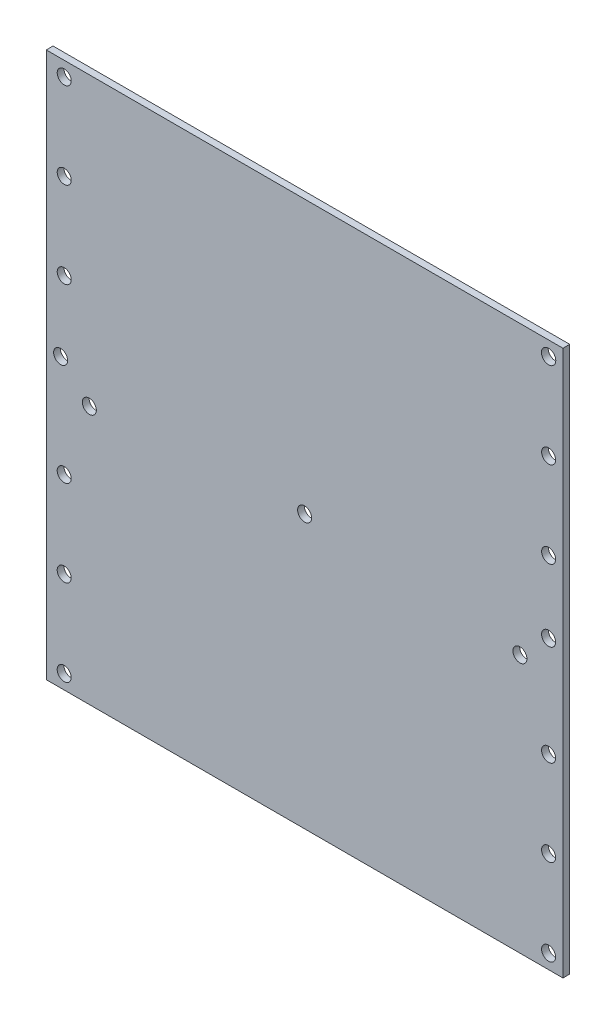
ISO-10303-21;
HEADER;
FILE_DESCRIPTION(('STEP AP214'),'2;1');
FILE_NAME('part.step','',(''),(''),'','','');
FILE_SCHEMA(('AUTOMOTIVE_DESIGN { 1 0 10303 214 1 1 1 1 }'));
ENDSEC;
DATA;
#1=APPLICATION_CONTEXT('core data for automotive mechanical design processes');
#2=APPLICATION_PROTOCOL_DEFINITION('international standard','automotive_design',2000,#1);
#3=PRODUCT_CONTEXT('',#1,'mechanical');
#4=PRODUCT('Part','Part','',(#3));
#5=PRODUCT_RELATED_PRODUCT_CATEGORY('part','',(#4));
#6=PRODUCT_DEFINITION_FORMATION('','',#4);
#7=PRODUCT_DEFINITION_CONTEXT('part definition',#1,'design');
#8=PRODUCT_DEFINITION('design','',#6,#7);
#9=PRODUCT_DEFINITION_SHAPE('','',#8);
#10=(LENGTH_UNIT() NAMED_UNIT(*) SI_UNIT(.MILLI.,.METRE.));
#11=(NAMED_UNIT(*) PLANE_ANGLE_UNIT() SI_UNIT($,.RADIAN.));
#12=(NAMED_UNIT(*) SI_UNIT($,.STERADIAN.) SOLID_ANGLE_UNIT());
#13=UNCERTAINTY_MEASURE_WITH_UNIT(LENGTH_MEASURE(1.E-05),#10,'distance_accuracy_value','');
#14=(GEOMETRIC_REPRESENTATION_CONTEXT(3) GLOBAL_UNCERTAINTY_ASSIGNED_CONTEXT((#13)) GLOBAL_UNIT_ASSIGNED_CONTEXT((#10,
#11,#12)) REPRESENTATION_CONTEXT('',''));
#15=CARTESIAN_POINT('',(0.,0.,0.));
#16=DIRECTION('',(0.,0.,1.));
#17=DIRECTION('',(1.,0.,0.));
#18=AXIS2_PLACEMENT_3D('',#15,#16,#17);
#19=CARTESIAN_POINT('',(-57.15,60.325,1.5));
#20=DIRECTION('',(1.,0.,0.));
#21=DIRECTION('',(0.,0.,-1.));
#22=AXIS2_PLACEMENT_3D('',#19,#20,#21);
#23=PLANE('',#22);
#24=DIRECTION('',(0.,-1.,0.));
#25=VECTOR('',#24,1.);
#26=CARTESIAN_POINT('',(-57.15,60.325,0.));
#27=LINE('',#26,#25);
#28=CARTESIAN_POINT('',(-57.15,60.325,0.));
#29=VERTEX_POINT('',#28);
#30=CARTESIAN_POINT('',(-57.15,-60.325,0.));
#31=VERTEX_POINT('',#30);
#32=EDGE_CURVE('E73',#29,#31,#27,.T.);
#33=ORIENTED_EDGE('',*,*,#32,.T.);
#34=DIRECTION('',(0.,0.,-1.));
#35=VECTOR('',#34,1.);
#36=CARTESIAN_POINT('',(-57.15,-60.325,1.5));
#37=LINE('',#36,#35);
#38=CARTESIAN_POINT('',(-57.15,-60.325,1.5));
#39=VERTEX_POINT('',#38);
#40=EDGE_CURVE('E11',#39,#31,#37,.T.);
#41=ORIENTED_EDGE('',*,*,#40,.F.);
#42=DIRECTION('',(0.,-1.,0.));
#43=VECTOR('',#42,1.);
#44=CARTESIAN_POINT('',(-57.15,60.325,1.5));
#45=LINE('',#44,#43);
#46=CARTESIAN_POINT('',(-57.15,60.325,1.5));
#47=VERTEX_POINT('',#46);
#48=EDGE_CURVE('E96',#47,#39,#45,.T.);
#49=ORIENTED_EDGE('',*,*,#48,.F.);
#50=DIRECTION('',(0.,0.,-1.));
#51=VECTOR('',#50,1.);
#52=CARTESIAN_POINT('',(-57.15,60.325,1.5));
#53=LINE('',#52,#51);
#54=EDGE_CURVE('E85',#47,#29,#53,.T.);
#55=ORIENTED_EDGE('',*,*,#54,.T.);
#56=EDGE_LOOP('',(#33,#41,#49,#55));
#57=FACE_BOUND('',#56,.T.);
#58=ADVANCED_FACE('F29',(#57),#23,.F.);
#59=CARTESIAN_POINT('',(-57.15,-60.325,1.5));
#60=DIRECTION('',(0.,1.,0.));
#61=DIRECTION('',(-1.,0.,0.));
#62=AXIS2_PLACEMENT_3D('',#59,#60,#61);
#63=PLANE('',#62);
#64=DIRECTION('',(1.,0.,0.));
#65=VECTOR('',#64,1.);
#66=CARTESIAN_POINT('',(-57.15,-60.325,0.));
#67=LINE('',#66,#65);
#68=CARTESIAN_POINT('',(57.15,-60.325,0.));
#69=VERTEX_POINT('',#68);
#70=EDGE_CURVE('E69',#31,#69,#67,.T.);
#71=ORIENTED_EDGE('',*,*,#70,.T.);
#72=DIRECTION('',(0.,0.,-1.));
#73=VECTOR('',#72,1.);
#74=CARTESIAN_POINT('',(57.15,-60.325,1.5));
#75=LINE('',#74,#73);
#76=CARTESIAN_POINT('',(57.15,-60.325,1.5));
#77=VERTEX_POINT('',#76);
#78=EDGE_CURVE('E36',#77,#69,#75,.T.);
#79=ORIENTED_EDGE('',*,*,#78,.F.);
#80=DIRECTION('',(1.,0.,0.));
#81=VECTOR('',#80,1.);
#82=CARTESIAN_POINT('',(-57.15,-60.325,1.5));
#83=LINE('',#82,#81);
#84=EDGE_CURVE('E81',#39,#77,#83,.T.);
#85=ORIENTED_EDGE('',*,*,#84,.F.);
#86=ORIENTED_EDGE('',*,*,#40,.T.);
#87=EDGE_LOOP('',(#71,#79,#85,#86));
#88=FACE_BOUND('',#87,.T.);
#89=ADVANCED_FACE('F80',(#88),#63,.F.);
#90=CARTESIAN_POINT('',(57.15,60.325,1.5));
#91=DIRECTION('',(-1.,0.,0.));
#92=DIRECTION('',(0.,-1.,0.));
#93=AXIS2_PLACEMENT_3D('',#90,#91,#92);
#94=PLANE('',#93);
#95=DIRECTION('',(0.,1.,0.));
#96=VECTOR('',#95,1.);
#97=CARTESIAN_POINT('',(57.15,60.325,0.));
#98=LINE('',#97,#96);
#99=CARTESIAN_POINT('',(57.15,60.325,0.));
#100=VERTEX_POINT('',#99);
#101=EDGE_CURVE('E74',#69,#100,#98,.T.);
#102=ORIENTED_EDGE('',*,*,#101,.T.);
#103=DIRECTION('',(0.,0.,-1.));
#104=VECTOR('',#103,1.);
#105=CARTESIAN_POINT('',(57.15,60.325,1.5));
#106=LINE('',#105,#104);
#107=CARTESIAN_POINT('',(57.15,60.325,1.5));
#108=VERTEX_POINT('',#107);
#109=EDGE_CURVE('E102',#108,#100,#106,.T.);
#110=ORIENTED_EDGE('',*,*,#109,.F.);
#111=DIRECTION('',(0.,1.,0.));
#112=VECTOR('',#111,1.);
#113=CARTESIAN_POINT('',(57.15,60.325,1.5));
#114=LINE('',#113,#112);
#115=EDGE_CURVE('E48',#77,#108,#114,.T.);
#116=ORIENTED_EDGE('',*,*,#115,.F.);
#117=ORIENTED_EDGE('',*,*,#78,.T.);
#118=EDGE_LOOP('',(#102,#110,#116,#117));
#119=FACE_BOUND('',#118,.T.);
#120=ADVANCED_FACE('F105',(#119),#94,.F.);
#121=CARTESIAN_POINT('',(-57.15,60.325,1.5));
#122=DIRECTION('',(0.,-1.,0.));
#123=DIRECTION('',(1.,0.,0.));
#124=AXIS2_PLACEMENT_3D('',#121,#122,#123);
#125=PLANE('',#124);
#126=DIRECTION('',(-1.,0.,0.));
#127=VECTOR('',#126,1.);
#128=CARTESIAN_POINT('',(-57.15,60.325,0.));
#129=LINE('',#128,#127);
#130=EDGE_CURVE('E94',#100,#29,#129,.T.);
#131=ORIENTED_EDGE('',*,*,#130,.T.);
#132=ORIENTED_EDGE('',*,*,#54,.F.);
#133=DIRECTION('',(-1.,0.,0.));
#134=VECTOR('',#133,1.);
#135=CARTESIAN_POINT('',(-57.15,60.325,1.5));
#136=LINE('',#135,#134);
#137=EDGE_CURVE('E43',#108,#47,#136,.T.);
#138=ORIENTED_EDGE('',*,*,#137,.F.);
#139=ORIENTED_EDGE('',*,*,#109,.T.);
#140=EDGE_LOOP('',(#131,#132,#138,#139));
#141=FACE_BOUND('',#140,.T.);
#142=ADVANCED_FACE('F107',(#141),#125,.F.);
#143=CARTESIAN_POINT('',(-57.15,60.325,1.5));
#144=DIRECTION('',(0.,0.,1.));
#145=DIRECTION('',(1.,0.,0.));
#146=AXIS2_PLACEMENT_3D('',#143,#144,#145);
#147=PLANE('',#146);
#148=CARTESIAN_POINT('',(53.975,-57.15,1.5));
#149=DIRECTION('',(0.,0.,1.));
#150=DIRECTION('',(1.,0.,0.));
#151=AXIS2_PLACEMENT_3D('',#148,#149,#150);
#152=CIRCLE('',#151,1.55);
#153=CARTESIAN_POINT('',(55.525,-57.15,1.5));
#154=VERTEX_POINT('',#153);
#155=EDGE_CURVE('E324',#154,#154,#152,.T.);
#156=ORIENTED_EDGE('',*,*,#155,.F.);
#157=EDGE_LOOP('',(#156));
#158=FACE_BOUND('',#157,.T.);
#159=CARTESIAN_POINT('',(53.975,-38.1,1.5));
#160=DIRECTION('',(0.,0.,1.));
#161=DIRECTION('',(1.,0.,0.));
#162=AXIS2_PLACEMENT_3D('',#159,#160,#161);
#163=CIRCLE('',#162,1.55);
#164=CARTESIAN_POINT('',(55.525,-38.1,1.5));
#165=VERTEX_POINT('',#164);
#166=EDGE_CURVE('E326',#165,#165,#163,.T.);
#167=ORIENTED_EDGE('',*,*,#166,.F.);
#168=EDGE_LOOP('',(#167));
#169=FACE_BOUND('',#168,.T.);
#170=CARTESIAN_POINT('',(53.975,-19.05,1.5));
#171=DIRECTION('',(0.,0.,1.));
#172=DIRECTION('',(1.,0.,0.));
#173=AXIS2_PLACEMENT_3D('',#170,#171,#172);
#174=CIRCLE('',#173,1.55);
#175=CARTESIAN_POINT('',(55.525,-19.05,1.5));
#176=VERTEX_POINT('',#175);
#177=EDGE_CURVE('E334',#176,#176,#174,.T.);
#178=ORIENTED_EDGE('',*,*,#177,.F.);
#179=EDGE_LOOP('',(#178));
#180=FACE_BOUND('',#179,.T.);
#181=CARTESIAN_POINT('',(53.975,19.05,1.5));
#182=DIRECTION('',(0.,0.,1.));
#183=DIRECTION('',(1.,0.,0.));
#184=AXIS2_PLACEMENT_3D('',#181,#182,#183);
#185=CIRCLE('',#184,1.55);
#186=CARTESIAN_POINT('',(55.525,19.05,1.5));
#187=VERTEX_POINT('',#186);
#188=EDGE_CURVE('E340',#187,#187,#185,.T.);
#189=ORIENTED_EDGE('',*,*,#188,.F.);
#190=EDGE_LOOP('',(#189));
#191=FACE_BOUND('',#190,.T.);
#192=CARTESIAN_POINT('',(53.975,38.1,1.5));
#193=DIRECTION('',(0.,0.,1.));
#194=DIRECTION('',(1.,0.,0.));
#195=AXIS2_PLACEMENT_3D('',#192,#193,#194);
#196=CIRCLE('',#195,1.55);
#197=CARTESIAN_POINT('',(55.525,38.1,1.5));
#198=VERTEX_POINT('',#197);
#199=EDGE_CURVE('E346',#198,#198,#196,.T.);
#200=ORIENTED_EDGE('',*,*,#199,.F.);
#201=EDGE_LOOP('',(#200));
#202=FACE_BOUND('',#201,.T.);
#203=CARTESIAN_POINT('',(53.975,57.15,1.5));
#204=DIRECTION('',(0.,0.,1.));
#205=DIRECTION('',(1.,0.,0.));
#206=AXIS2_PLACEMENT_3D('',#203,#204,#205);
#207=CIRCLE('',#206,1.58750000000001);
#208=CARTESIAN_POINT('',(55.5625,57.15,1.5));
#209=VERTEX_POINT('',#208);
#210=EDGE_CURVE('E352',#209,#209,#207,.T.);
#211=ORIENTED_EDGE('',*,*,#210,.F.);
#212=EDGE_LOOP('',(#211));
#213=FACE_BOUND('',#212,.T.);
#214=CARTESIAN_POINT('',(-53.18125,-57.15,1.5));
#215=DIRECTION('',(0.,0.,1.));
#216=DIRECTION('',(1.,0.,0.));
#217=AXIS2_PLACEMENT_3D('',#214,#215,#216);
#218=CIRCLE('',#217,1.55);
#219=CARTESIAN_POINT('',(-51.63125,-57.15,1.5));
#220=VERTEX_POINT('',#219);
#221=EDGE_CURVE('E358',#220,#220,#218,.T.);
#222=ORIENTED_EDGE('',*,*,#221,.F.);
#223=EDGE_LOOP('',(#222));
#224=FACE_BOUND('',#223,.T.);
#225=CARTESIAN_POINT('',(-53.18125,-38.1,1.5));
#226=DIRECTION('',(0.,0.,1.));
#227=DIRECTION('',(1.,0.,0.));
#228=AXIS2_PLACEMENT_3D('',#225,#226,#227);
#229=CIRCLE('',#228,1.55);
#230=CARTESIAN_POINT('',(-51.63125,-38.1,1.5));
#231=VERTEX_POINT('',#230);
#232=EDGE_CURVE('E364',#231,#231,#229,.T.);
#233=ORIENTED_EDGE('',*,*,#232,.F.);
#234=EDGE_LOOP('',(#233));
#235=FACE_BOUND('',#234,.T.);
#236=CARTESIAN_POINT('',(-53.18125,19.05,1.5));
#237=DIRECTION('',(0.,0.,1.));
#238=DIRECTION('',(1.,0.,0.));
#239=AXIS2_PLACEMENT_3D('',#236,#237,#238);
#240=CIRCLE('',#239,1.55);
#241=CARTESIAN_POINT('',(-51.63125,19.05,1.5));
#242=VERTEX_POINT('',#241);
#243=EDGE_CURVE('E370',#242,#242,#240,.T.);
#244=ORIENTED_EDGE('',*,*,#243,.F.);
#245=EDGE_LOOP('',(#244));
#246=FACE_BOUND('',#245,.T.);
#247=CARTESIAN_POINT('',(-53.18125,38.1,1.5));
#248=DIRECTION('',(0.,0.,1.));
#249=DIRECTION('',(1.,0.,0.));
#250=AXIS2_PLACEMENT_3D('',#247,#248,#249);
#251=CIRCLE('',#250,1.55);
#252=CARTESIAN_POINT('',(-51.63125,38.1,1.5));
#253=VERTEX_POINT('',#252);
#254=EDGE_CURVE('E376',#253,#253,#251,.T.);
#255=ORIENTED_EDGE('',*,*,#254,.F.);
#256=EDGE_LOOP('',(#255));
#257=FACE_BOUND('',#256,.T.);
#258=CARTESIAN_POINT('',(-53.18125,-19.05,1.5));
#259=DIRECTION('',(0.,0.,1.));
#260=DIRECTION('',(1.,0.,0.));
#261=AXIS2_PLACEMENT_3D('',#258,#259,#260);
#262=CIRCLE('',#261,1.55);
#263=CARTESIAN_POINT('',(-51.63125,-19.05,1.5));
#264=VERTEX_POINT('',#263);
#265=EDGE_CURVE('E382',#264,#264,#262,.T.);
#266=ORIENTED_EDGE('',*,*,#265,.F.);
#267=EDGE_LOOP('',(#266));
#268=FACE_BOUND('',#267,.T.);
#269=CARTESIAN_POINT('',(-53.18125,57.15,1.5));
#270=DIRECTION('',(0.,0.,1.));
#271=DIRECTION('',(1.,0.,0.));
#272=AXIS2_PLACEMENT_3D('',#269,#270,#271);
#273=CIRCLE('',#272,1.55);
#274=CARTESIAN_POINT('',(-51.63125,57.15,1.5));
#275=VERTEX_POINT('',#274);
#276=EDGE_CURVE('E388',#275,#275,#273,.T.);
#277=ORIENTED_EDGE('',*,*,#276,.F.);
#278=EDGE_LOOP('',(#277));
#279=FACE_BOUND('',#278,.T.);
#280=CARTESIAN_POINT('',(0.,0.,1.5));
#281=DIRECTION('',(0.,0.,1.));
#282=DIRECTION('',(1.,0.,0.));
#283=AXIS2_PLACEMENT_3D('',#280,#281,#282);
#284=CIRCLE('',#283,1.55);
#285=CARTESIAN_POINT('',(1.55,0.,1.5));
#286=VERTEX_POINT('',#285);
#287=EDGE_CURVE('E394',#286,#286,#284,.T.);
#288=ORIENTED_EDGE('',*,*,#287,.F.);
#289=EDGE_LOOP('',(#288));
#290=FACE_BOUND('',#289,.T.);
#291=CARTESIAN_POINT('',(47.625,-3.175,1.5));
#292=DIRECTION('',(0.,0.,1.));
#293=DIRECTION('',(1.,0.,0.));
#294=AXIS2_PLACEMENT_3D('',#291,#292,#293);
#295=CIRCLE('',#294,1.55);
#296=CARTESIAN_POINT('',(49.175,-3.175,1.5));
#297=VERTEX_POINT('',#296);
#298=EDGE_CURVE('E400',#297,#297,#295,.T.);
#299=ORIENTED_EDGE('',*,*,#298,.F.);
#300=EDGE_LOOP('',(#299));
#301=FACE_BOUND('',#300,.T.);
#302=CARTESIAN_POINT('',(53.975,3.175,1.5));
#303=DIRECTION('',(0.,0.,1.));
#304=DIRECTION('',(1.,0.,0.));
#305=AXIS2_PLACEMENT_3D('',#302,#303,#304);
#306=CIRCLE('',#305,1.55);
#307=CARTESIAN_POINT('',(55.525,3.175,1.5));
#308=VERTEX_POINT('',#307);
#309=EDGE_CURVE('E406',#308,#308,#306,.T.);
#310=ORIENTED_EDGE('',*,*,#309,.F.);
#311=EDGE_LOOP('',(#310));
#312=FACE_BOUND('',#311,.T.);
#313=CARTESIAN_POINT('',(-47.625,-3.175,1.5));
#314=DIRECTION('',(0.,0.,1.));
#315=DIRECTION('',(1.,0.,0.));
#316=AXIS2_PLACEMENT_3D('',#313,#314,#315);
#317=CIRCLE('',#316,1.55);
#318=CARTESIAN_POINT('',(-46.075,-3.175,1.5));
#319=VERTEX_POINT('',#318);
#320=EDGE_CURVE('E412',#319,#319,#317,.T.);
#321=ORIENTED_EDGE('',*,*,#320,.F.);
#322=EDGE_LOOP('',(#321));
#323=FACE_BOUND('',#322,.T.);
#324=CARTESIAN_POINT('',(-53.975,3.175,1.5));
#325=DIRECTION('',(0.,0.,1.));
#326=DIRECTION('',(1.,0.,0.));
#327=AXIS2_PLACEMENT_3D('',#324,#325,#326);
#328=CIRCLE('',#327,1.55);
#329=CARTESIAN_POINT('',(-52.425,3.175,1.5));
#330=VERTEX_POINT('',#329);
#331=EDGE_CURVE('E89',#330,#330,#328,.T.);
#332=ORIENTED_EDGE('',*,*,#331,.F.);
#333=EDGE_LOOP('',(#332));
#334=FACE_BOUND('',#333,.T.);
#335=ORIENTED_EDGE('',*,*,#48,.T.);
#336=ORIENTED_EDGE('',*,*,#84,.T.);
#337=ORIENTED_EDGE('',*,*,#115,.T.);
#338=ORIENTED_EDGE('',*,*,#137,.T.);
#339=EDGE_LOOP('',(#335,#336,#337,#338));
#340=FACE_BOUND('',#339,.T.);
#341=ADVANCED_FACE('F108',(#158,#169,#180,#191,#202,#213,#224,#235,#246,#257,#268,#279,#290,
#301,#312,#323,#334,#340),#147,.T.);
#342=CARTESIAN_POINT('',(-57.15,60.325,0.));
#343=DIRECTION('',(0.,0.,1.));
#344=DIRECTION('',(1.,0.,0.));
#345=AXIS2_PLACEMENT_3D('',#342,#343,#344);
#346=PLANE('',#345);
#347=CARTESIAN_POINT('',(53.975,-57.15,0.));
#348=DIRECTION('',(0.,0.,1.));
#349=DIRECTION('',(1.,0.,0.));
#350=AXIS2_PLACEMENT_3D('',#347,#348,#349);
#351=CIRCLE('',#350,1.55);
#352=CARTESIAN_POINT('',(55.525,-57.15,0.));
#353=VERTEX_POINT('',#352);
#354=EDGE_CURVE('E322',#353,#353,#351,.T.);
#355=ORIENTED_EDGE('',*,*,#354,.T.);
#356=EDGE_LOOP('',(#355));
#357=FACE_BOUND('',#356,.T.);
#358=CARTESIAN_POINT('',(53.975,-38.1,0.));
#359=DIRECTION('',(0.,0.,1.));
#360=DIRECTION('',(1.,0.,0.));
#361=AXIS2_PLACEMENT_3D('',#358,#359,#360);
#362=CIRCLE('',#361,1.55);
#363=CARTESIAN_POINT('',(55.525,-38.1,0.));
#364=VERTEX_POINT('',#363);
#365=EDGE_CURVE('E331',#364,#364,#362,.T.);
#366=ORIENTED_EDGE('',*,*,#365,.T.);
#367=EDGE_LOOP('',(#366));
#368=FACE_BOUND('',#367,.T.);
#369=CARTESIAN_POINT('',(53.975,-19.05,0.));
#370=DIRECTION('',(0.,0.,1.));
#371=DIRECTION('',(1.,0.,0.));
#372=AXIS2_PLACEMENT_3D('',#369,#370,#371);
#373=CIRCLE('',#372,1.55);
#374=CARTESIAN_POINT('',(55.525,-19.05,0.));
#375=VERTEX_POINT('',#374);
#376=EDGE_CURVE('E337',#375,#375,#373,.T.);
#377=ORIENTED_EDGE('',*,*,#376,.T.);
#378=EDGE_LOOP('',(#377));
#379=FACE_BOUND('',#378,.T.);
#380=CARTESIAN_POINT('',(53.975,19.05,0.));
#381=DIRECTION('',(0.,0.,1.));
#382=DIRECTION('',(1.,0.,0.));
#383=AXIS2_PLACEMENT_3D('',#380,#381,#382);
#384=CIRCLE('',#383,1.55);
#385=CARTESIAN_POINT('',(55.525,19.05,0.));
#386=VERTEX_POINT('',#385);
#387=EDGE_CURVE('E343',#386,#386,#384,.T.);
#388=ORIENTED_EDGE('',*,*,#387,.T.);
#389=EDGE_LOOP('',(#388));
#390=FACE_BOUND('',#389,.T.);
#391=CARTESIAN_POINT('',(53.975,38.1,0.));
#392=DIRECTION('',(0.,0.,1.));
#393=DIRECTION('',(1.,0.,0.));
#394=AXIS2_PLACEMENT_3D('',#391,#392,#393);
#395=CIRCLE('',#394,1.55);
#396=CARTESIAN_POINT('',(55.525,38.1,0.));
#397=VERTEX_POINT('',#396);
#398=EDGE_CURVE('E349',#397,#397,#395,.T.);
#399=ORIENTED_EDGE('',*,*,#398,.T.);
#400=EDGE_LOOP('',(#399));
#401=FACE_BOUND('',#400,.T.);
#402=CARTESIAN_POINT('',(53.975,57.15,0.));
#403=DIRECTION('',(0.,0.,1.));
#404=DIRECTION('',(1.,0.,0.));
#405=AXIS2_PLACEMENT_3D('',#402,#403,#404);
#406=CIRCLE('',#405,1.58750000000001);
#407=CARTESIAN_POINT('',(55.5625,57.15,0.));
#408=VERTEX_POINT('',#407);
#409=EDGE_CURVE('E355',#408,#408,#406,.T.);
#410=ORIENTED_EDGE('',*,*,#409,.T.);
#411=EDGE_LOOP('',(#410));
#412=FACE_BOUND('',#411,.T.);
#413=CARTESIAN_POINT('',(-53.18125,-57.15,0.));
#414=DIRECTION('',(0.,0.,1.));
#415=DIRECTION('',(1.,0.,0.));
#416=AXIS2_PLACEMENT_3D('',#413,#414,#415);
#417=CIRCLE('',#416,1.55);
#418=CARTESIAN_POINT('',(-51.63125,-57.15,0.));
#419=VERTEX_POINT('',#418);
#420=EDGE_CURVE('E361',#419,#419,#417,.T.);
#421=ORIENTED_EDGE('',*,*,#420,.T.);
#422=EDGE_LOOP('',(#421));
#423=FACE_BOUND('',#422,.T.);
#424=CARTESIAN_POINT('',(-53.18125,-38.1,0.));
#425=DIRECTION('',(0.,0.,1.));
#426=DIRECTION('',(1.,0.,0.));
#427=AXIS2_PLACEMENT_3D('',#424,#425,#426);
#428=CIRCLE('',#427,1.55);
#429=CARTESIAN_POINT('',(-51.63125,-38.1,0.));
#430=VERTEX_POINT('',#429);
#431=EDGE_CURVE('E367',#430,#430,#428,.T.);
#432=ORIENTED_EDGE('',*,*,#431,.T.);
#433=EDGE_LOOP('',(#432));
#434=FACE_BOUND('',#433,.T.);
#435=CARTESIAN_POINT('',(-53.18125,19.05,0.));
#436=DIRECTION('',(0.,0.,1.));
#437=DIRECTION('',(1.,0.,0.));
#438=AXIS2_PLACEMENT_3D('',#435,#436,#437);
#439=CIRCLE('',#438,1.55);
#440=CARTESIAN_POINT('',(-51.63125,19.05,0.));
#441=VERTEX_POINT('',#440);
#442=EDGE_CURVE('E373',#441,#441,#439,.T.);
#443=ORIENTED_EDGE('',*,*,#442,.T.);
#444=EDGE_LOOP('',(#443));
#445=FACE_BOUND('',#444,.T.);
#446=CARTESIAN_POINT('',(-53.18125,38.1,0.));
#447=DIRECTION('',(0.,0.,1.));
#448=DIRECTION('',(1.,0.,0.));
#449=AXIS2_PLACEMENT_3D('',#446,#447,#448);
#450=CIRCLE('',#449,1.55);
#451=CARTESIAN_POINT('',(-51.63125,38.1,0.));
#452=VERTEX_POINT('',#451);
#453=EDGE_CURVE('E379',#452,#452,#450,.T.);
#454=ORIENTED_EDGE('',*,*,#453,.T.);
#455=EDGE_LOOP('',(#454));
#456=FACE_BOUND('',#455,.T.);
#457=CARTESIAN_POINT('',(-53.18125,-19.05,0.));
#458=DIRECTION('',(0.,0.,1.));
#459=DIRECTION('',(1.,0.,0.));
#460=AXIS2_PLACEMENT_3D('',#457,#458,#459);
#461=CIRCLE('',#460,1.55);
#462=CARTESIAN_POINT('',(-51.63125,-19.05,0.));
#463=VERTEX_POINT('',#462);
#464=EDGE_CURVE('E385',#463,#463,#461,.T.);
#465=ORIENTED_EDGE('',*,*,#464,.T.);
#466=EDGE_LOOP('',(#465));
#467=FACE_BOUND('',#466,.T.);
#468=CARTESIAN_POINT('',(-53.18125,57.15,0.));
#469=DIRECTION('',(0.,0.,1.));
#470=DIRECTION('',(1.,0.,0.));
#471=AXIS2_PLACEMENT_3D('',#468,#469,#470);
#472=CIRCLE('',#471,1.55);
#473=CARTESIAN_POINT('',(-51.63125,57.15,0.));
#474=VERTEX_POINT('',#473);
#475=EDGE_CURVE('E391',#474,#474,#472,.T.);
#476=ORIENTED_EDGE('',*,*,#475,.T.);
#477=EDGE_LOOP('',(#476));
#478=FACE_BOUND('',#477,.T.);
#479=CARTESIAN_POINT('',(0.,0.,0.));
#480=DIRECTION('',(0.,0.,1.));
#481=DIRECTION('',(1.,0.,0.));
#482=AXIS2_PLACEMENT_3D('',#479,#480,#481);
#483=CIRCLE('',#482,1.55);
#484=CARTESIAN_POINT('',(1.55,0.,0.));
#485=VERTEX_POINT('',#484);
#486=EDGE_CURVE('E397',#485,#485,#483,.T.);
#487=ORIENTED_EDGE('',*,*,#486,.T.);
#488=EDGE_LOOP('',(#487));
#489=FACE_BOUND('',#488,.T.);
#490=CARTESIAN_POINT('',(47.625,-3.175,0.));
#491=DIRECTION('',(0.,0.,1.));
#492=DIRECTION('',(1.,0.,0.));
#493=AXIS2_PLACEMENT_3D('',#490,#491,#492);
#494=CIRCLE('',#493,1.55);
#495=CARTESIAN_POINT('',(49.175,-3.175,0.));
#496=VERTEX_POINT('',#495);
#497=EDGE_CURVE('E403',#496,#496,#494,.T.);
#498=ORIENTED_EDGE('',*,*,#497,.T.);
#499=EDGE_LOOP('',(#498));
#500=FACE_BOUND('',#499,.T.);
#501=CARTESIAN_POINT('',(53.975,3.175,0.));
#502=DIRECTION('',(0.,0.,1.));
#503=DIRECTION('',(1.,0.,0.));
#504=AXIS2_PLACEMENT_3D('',#501,#502,#503);
#505=CIRCLE('',#504,1.55);
#506=CARTESIAN_POINT('',(55.525,3.175,0.));
#507=VERTEX_POINT('',#506);
#508=EDGE_CURVE('E409',#507,#507,#505,.T.);
#509=ORIENTED_EDGE('',*,*,#508,.T.);
#510=EDGE_LOOP('',(#509));
#511=FACE_BOUND('',#510,.T.);
#512=CARTESIAN_POINT('',(-47.625,-3.175,0.));
#513=DIRECTION('',(0.,0.,1.));
#514=DIRECTION('',(1.,0.,0.));
#515=AXIS2_PLACEMENT_3D('',#512,#513,#514);
#516=CIRCLE('',#515,1.55);
#517=CARTESIAN_POINT('',(-46.075,-3.175,0.));
#518=VERTEX_POINT('',#517);
#519=EDGE_CURVE('E415',#518,#518,#516,.T.);
#520=ORIENTED_EDGE('',*,*,#519,.T.);
#521=EDGE_LOOP('',(#520));
#522=FACE_BOUND('',#521,.T.);
#523=CARTESIAN_POINT('',(-53.975,3.175,0.));
#524=DIRECTION('',(0.,0.,1.));
#525=DIRECTION('',(1.,0.,0.));
#526=AXIS2_PLACEMENT_3D('',#523,#524,#525);
#527=CIRCLE('',#526,1.55);
#528=CARTESIAN_POINT('',(-52.425,3.175,0.));
#529=VERTEX_POINT('',#528);
#530=EDGE_CURVE('E86',#529,#529,#527,.T.);
#531=ORIENTED_EDGE('',*,*,#530,.T.);
#532=EDGE_LOOP('',(#531));
#533=FACE_BOUND('',#532,.T.);
#534=ORIENTED_EDGE('',*,*,#32,.F.);
#535=ORIENTED_EDGE('',*,*,#130,.F.);
#536=ORIENTED_EDGE('',*,*,#101,.F.);
#537=ORIENTED_EDGE('',*,*,#70,.F.);
#538=EDGE_LOOP('',(#534,#535,#536,#537));
#539=FACE_BOUND('',#538,.T.);
#540=ADVANCED_FACE('F70',(#357,#368,#379,#390,#401,#412,#423,#434,#445,#456,#467,#478,#489,#500,
#511,#522,#533,#539),#346,.F.);
#541=CARTESIAN_POINT('',(-53.975,3.175,0.));
#542=DIRECTION('',(0.,0.,1.));
#543=DIRECTION('',(1.,0.,0.));
#544=AXIS2_PLACEMENT_3D('',#541,#542,#543);
#545=CYLINDRICAL_SURFACE('',#544,1.55);
#546=ORIENTED_EDGE('',*,*,#530,.F.);
#547=EDGE_LOOP('',(#546));
#548=FACE_BOUND('',#547,.T.);
#549=ORIENTED_EDGE('',*,*,#331,.T.);
#550=EDGE_LOOP('',(#549));
#551=FACE_BOUND('',#550,.T.);
#552=ADVANCED_FACE('F116',(#548,#551),#545,.F.);
#553=CARTESIAN_POINT('',(-47.625,-3.175,0.));
#554=DIRECTION('',(0.,0.,1.));
#555=DIRECTION('',(1.,0.,0.));
#556=AXIS2_PLACEMENT_3D('',#553,#554,#555);
#557=CYLINDRICAL_SURFACE('',#556,1.55);
#558=ORIENTED_EDGE('',*,*,#519,.F.);
#559=EDGE_LOOP('',(#558));
#560=FACE_BOUND('',#559,.T.);
#561=ORIENTED_EDGE('',*,*,#320,.T.);
#562=EDGE_LOOP('',(#561));
#563=FACE_BOUND('',#562,.T.);
#564=ADVANCED_FACE('F155',(#560,#563),#557,.F.);
#565=CARTESIAN_POINT('',(53.975,3.175,0.));
#566=DIRECTION('',(0.,0.,1.));
#567=DIRECTION('',(1.,0.,0.));
#568=AXIS2_PLACEMENT_3D('',#565,#566,#567);
#569=CYLINDRICAL_SURFACE('',#568,1.55);
#570=ORIENTED_EDGE('',*,*,#508,.F.);
#571=EDGE_LOOP('',(#570));
#572=FACE_BOUND('',#571,.T.);
#573=ORIENTED_EDGE('',*,*,#309,.T.);
#574=EDGE_LOOP('',(#573));
#575=FACE_BOUND('',#574,.T.);
#576=ADVANCED_FACE('F165',(#572,#575),#569,.F.);
#577=CARTESIAN_POINT('',(47.625,-3.175,0.));
#578=DIRECTION('',(0.,0.,1.));
#579=DIRECTION('',(1.,0.,0.));
#580=AXIS2_PLACEMENT_3D('',#577,#578,#579);
#581=CYLINDRICAL_SURFACE('',#580,1.55);
#582=ORIENTED_EDGE('',*,*,#497,.F.);
#583=EDGE_LOOP('',(#582));
#584=FACE_BOUND('',#583,.T.);
#585=ORIENTED_EDGE('',*,*,#298,.T.);
#586=EDGE_LOOP('',(#585));
#587=FACE_BOUND('',#586,.T.);
#588=ADVANCED_FACE('F175',(#584,#587),#581,.F.);
#589=CARTESIAN_POINT('',(0.,0.,0.));
#590=DIRECTION('',(0.,0.,1.));
#591=DIRECTION('',(1.,0.,0.));
#592=AXIS2_PLACEMENT_3D('',#589,#590,#591);
#593=CYLINDRICAL_SURFACE('',#592,1.55);
#594=ORIENTED_EDGE('',*,*,#486,.F.);
#595=EDGE_LOOP('',(#594));
#596=FACE_BOUND('',#595,.T.);
#597=ORIENTED_EDGE('',*,*,#287,.T.);
#598=EDGE_LOOP('',(#597));
#599=FACE_BOUND('',#598,.T.);
#600=ADVANCED_FACE('F185',(#596,#599),#593,.F.);
#601=CARTESIAN_POINT('',(-53.18125,57.15,0.));
#602=DIRECTION('',(0.,0.,1.));
#603=DIRECTION('',(1.,0.,0.));
#604=AXIS2_PLACEMENT_3D('',#601,#602,#603);
#605=CYLINDRICAL_SURFACE('',#604,1.55);
#606=ORIENTED_EDGE('',*,*,#475,.F.);
#607=EDGE_LOOP('',(#606));
#608=FACE_BOUND('',#607,.T.);
#609=ORIENTED_EDGE('',*,*,#276,.T.);
#610=EDGE_LOOP('',(#609));
#611=FACE_BOUND('',#610,.T.);
#612=ADVANCED_FACE('F195',(#608,#611),#605,.F.);
#613=CARTESIAN_POINT('',(-53.18125,-19.05,0.));
#614=DIRECTION('',(0.,0.,1.));
#615=DIRECTION('',(1.,0.,0.));
#616=AXIS2_PLACEMENT_3D('',#613,#614,#615);
#617=CYLINDRICAL_SURFACE('',#616,1.55);
#618=ORIENTED_EDGE('',*,*,#464,.F.);
#619=EDGE_LOOP('',(#618));
#620=FACE_BOUND('',#619,.T.);
#621=ORIENTED_EDGE('',*,*,#265,.T.);
#622=EDGE_LOOP('',(#621));
#623=FACE_BOUND('',#622,.T.);
#624=ADVANCED_FACE('F205',(#620,#623),#617,.F.);
#625=CARTESIAN_POINT('',(-53.18125,38.1,0.));
#626=DIRECTION('',(0.,0.,1.));
#627=DIRECTION('',(1.,0.,0.));
#628=AXIS2_PLACEMENT_3D('',#625,#626,#627);
#629=CYLINDRICAL_SURFACE('',#628,1.55);
#630=ORIENTED_EDGE('',*,*,#453,.F.);
#631=EDGE_LOOP('',(#630));
#632=FACE_BOUND('',#631,.T.);
#633=ORIENTED_EDGE('',*,*,#254,.T.);
#634=EDGE_LOOP('',(#633));
#635=FACE_BOUND('',#634,.T.);
#636=ADVANCED_FACE('F215',(#632,#635),#629,.F.);
#637=CARTESIAN_POINT('',(-53.18125,19.05,0.));
#638=DIRECTION('',(0.,0.,1.));
#639=DIRECTION('',(1.,0.,0.));
#640=AXIS2_PLACEMENT_3D('',#637,#638,#639);
#641=CYLINDRICAL_SURFACE('',#640,1.55);
#642=ORIENTED_EDGE('',*,*,#442,.F.);
#643=EDGE_LOOP('',(#642));
#644=FACE_BOUND('',#643,.T.);
#645=ORIENTED_EDGE('',*,*,#243,.T.);
#646=EDGE_LOOP('',(#645));
#647=FACE_BOUND('',#646,.T.);
#648=ADVANCED_FACE('F225',(#644,#647),#641,.F.);
#649=CARTESIAN_POINT('',(-53.18125,-38.1,0.));
#650=DIRECTION('',(0.,0.,1.));
#651=DIRECTION('',(1.,0.,0.));
#652=AXIS2_PLACEMENT_3D('',#649,#650,#651);
#653=CYLINDRICAL_SURFACE('',#652,1.55);
#654=ORIENTED_EDGE('',*,*,#431,.F.);
#655=EDGE_LOOP('',(#654));
#656=FACE_BOUND('',#655,.T.);
#657=ORIENTED_EDGE('',*,*,#232,.T.);
#658=EDGE_LOOP('',(#657));
#659=FACE_BOUND('',#658,.T.);
#660=ADVANCED_FACE('F235',(#656,#659),#653,.F.);
#661=CARTESIAN_POINT('',(-53.18125,-57.15,0.));
#662=DIRECTION('',(0.,0.,1.));
#663=DIRECTION('',(1.,0.,0.));
#664=AXIS2_PLACEMENT_3D('',#661,#662,#663);
#665=CYLINDRICAL_SURFACE('',#664,1.55);
#666=ORIENTED_EDGE('',*,*,#420,.F.);
#667=EDGE_LOOP('',(#666));
#668=FACE_BOUND('',#667,.T.);
#669=ORIENTED_EDGE('',*,*,#221,.T.);
#670=EDGE_LOOP('',(#669));
#671=FACE_BOUND('',#670,.T.);
#672=ADVANCED_FACE('F245',(#668,#671),#665,.F.);
#673=CARTESIAN_POINT('',(53.975,57.15,0.));
#674=DIRECTION('',(0.,0.,1.));
#675=DIRECTION('',(1.,0.,0.));
#676=AXIS2_PLACEMENT_3D('',#673,#674,#675);
#677=CYLINDRICAL_SURFACE('',#676,1.58750000000001);
#678=ORIENTED_EDGE('',*,*,#409,.F.);
#679=EDGE_LOOP('',(#678));
#680=FACE_BOUND('',#679,.T.);
#681=ORIENTED_EDGE('',*,*,#210,.T.);
#682=EDGE_LOOP('',(#681));
#683=FACE_BOUND('',#682,.T.);
#684=ADVANCED_FACE('F255',(#680,#683),#677,.F.);
#685=CARTESIAN_POINT('',(53.975,38.1,0.));
#686=DIRECTION('',(0.,0.,1.));
#687=DIRECTION('',(1.,0.,0.));
#688=AXIS2_PLACEMENT_3D('',#685,#686,#687);
#689=CYLINDRICAL_SURFACE('',#688,1.55);
#690=ORIENTED_EDGE('',*,*,#398,.F.);
#691=EDGE_LOOP('',(#690));
#692=FACE_BOUND('',#691,.T.);
#693=ORIENTED_EDGE('',*,*,#199,.T.);
#694=EDGE_LOOP('',(#693));
#695=FACE_BOUND('',#694,.T.);
#696=ADVANCED_FACE('F265',(#692,#695),#689,.F.);
#697=CARTESIAN_POINT('',(53.975,19.05,0.));
#698=DIRECTION('',(0.,0.,1.));
#699=DIRECTION('',(1.,0.,0.));
#700=AXIS2_PLACEMENT_3D('',#697,#698,#699);
#701=CYLINDRICAL_SURFACE('',#700,1.55);
#702=ORIENTED_EDGE('',*,*,#387,.F.);
#703=EDGE_LOOP('',(#702));
#704=FACE_BOUND('',#703,.T.);
#705=ORIENTED_EDGE('',*,*,#188,.T.);
#706=EDGE_LOOP('',(#705));
#707=FACE_BOUND('',#706,.T.);
#708=ADVANCED_FACE('F275',(#704,#707),#701,.F.);
#709=CARTESIAN_POINT('',(53.975,-19.05,0.));
#710=DIRECTION('',(0.,0.,1.));
#711=DIRECTION('',(1.,0.,0.));
#712=AXIS2_PLACEMENT_3D('',#709,#710,#711);
#713=CYLINDRICAL_SURFACE('',#712,1.55);
#714=ORIENTED_EDGE('',*,*,#376,.F.);
#715=EDGE_LOOP('',(#714));
#716=FACE_BOUND('',#715,.T.);
#717=ORIENTED_EDGE('',*,*,#177,.T.);
#718=EDGE_LOOP('',(#717));
#719=FACE_BOUND('',#718,.T.);
#720=ADVANCED_FACE('F285',(#716,#719),#713,.F.);
#721=CARTESIAN_POINT('',(53.975,-38.1,0.));
#722=DIRECTION('',(0.,0.,1.));
#723=DIRECTION('',(1.,0.,0.));
#724=AXIS2_PLACEMENT_3D('',#721,#722,#723);
#725=CYLINDRICAL_SURFACE('',#724,1.55);
#726=ORIENTED_EDGE('',*,*,#365,.F.);
#727=EDGE_LOOP('',(#726));
#728=FACE_BOUND('',#727,.T.);
#729=ORIENTED_EDGE('',*,*,#166,.T.);
#730=EDGE_LOOP('',(#729));
#731=FACE_BOUND('',#730,.T.);
#732=ADVANCED_FACE('F295',(#728,#731),#725,.F.);
#733=CARTESIAN_POINT('',(53.975,-57.15,0.));
#734=DIRECTION('',(0.,0.,1.));
#735=DIRECTION('',(1.,0.,0.));
#736=AXIS2_PLACEMENT_3D('',#733,#734,#735);
#737=CYLINDRICAL_SURFACE('',#736,1.55);
#738=ORIENTED_EDGE('',*,*,#354,.F.);
#739=EDGE_LOOP('',(#738));
#740=FACE_BOUND('',#739,.T.);
#741=ORIENTED_EDGE('',*,*,#155,.T.);
#742=EDGE_LOOP('',(#741));
#743=FACE_BOUND('',#742,.T.);
#744=ADVANCED_FACE('F305',(#740,#743),#737,.F.);
#745=CLOSED_SHELL('',(#58,#89,#120,#142,#341,#540,#552,#564,#576,#588,#600,#612,#624,#636,#648,
#660,#672,#684,#696,#708,#720,#732,#744));
#746=MANIFOLD_SOLID_BREP('B2',#745);
#747=ADVANCED_BREP_SHAPE_REPRESENTATION('',(#18,#746),#14);
#748=SHAPE_DEFINITION_REPRESENTATION(#9,#747);
ENDSEC;
END-ISO-10303-21;
